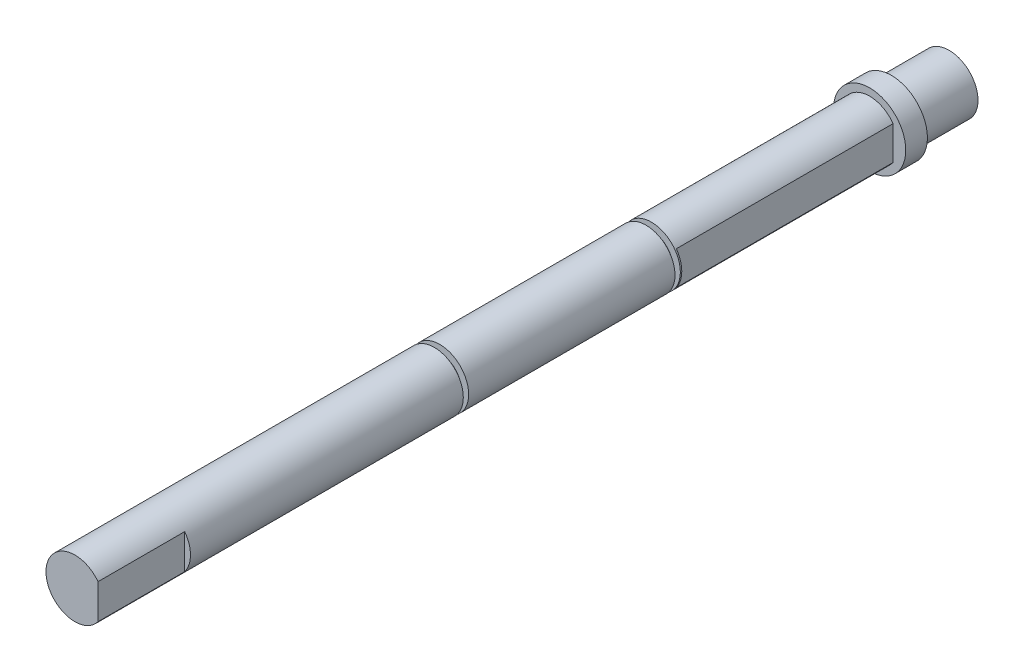
ISO-10303-21;
HEADER;
FILE_DESCRIPTION(('STEP AP214'),'2;1');
FILE_NAME('part.step','',(''),(''),'','','');
FILE_SCHEMA(('AUTOMOTIVE_DESIGN { 1 0 10303 214 1 1 1 1 }'));
ENDSEC;
DATA;
#1=APPLICATION_CONTEXT('core data for automotive mechanical design processes');
#2=APPLICATION_PROTOCOL_DEFINITION('international standard','automotive_design',2000,#1);
#3=PRODUCT_CONTEXT('',#1,'mechanical');
#4=PRODUCT('Part','Part','',(#3));
#5=PRODUCT_RELATED_PRODUCT_CATEGORY('part','',(#4));
#6=PRODUCT_DEFINITION_FORMATION('','',#4);
#7=PRODUCT_DEFINITION_CONTEXT('part definition',#1,'design');
#8=PRODUCT_DEFINITION('design','',#6,#7);
#9=PRODUCT_DEFINITION_SHAPE('','',#8);
#10=(LENGTH_UNIT() NAMED_UNIT(*) SI_UNIT(.MILLI.,.METRE.));
#11=(NAMED_UNIT(*) PLANE_ANGLE_UNIT() SI_UNIT($,.RADIAN.));
#12=(NAMED_UNIT(*) SI_UNIT($,.STERADIAN.) SOLID_ANGLE_UNIT());
#13=UNCERTAINTY_MEASURE_WITH_UNIT(LENGTH_MEASURE(1.E-05),#10,'distance_accuracy_value','');
#14=(GEOMETRIC_REPRESENTATION_CONTEXT(3) GLOBAL_UNCERTAINTY_ASSIGNED_CONTEXT((#13)) GLOBAL_UNIT_ASSIGNED_CONTEXT((#10,
#11,#12)) REPRESENTATION_CONTEXT('',''));
#15=CARTESIAN_POINT('',(0.,0.,0.));
#16=DIRECTION('',(0.,0.,1.));
#17=DIRECTION('',(1.,0.,0.));
#18=AXIS2_PLACEMENT_3D('',#15,#16,#17);
#19=CARTESIAN_POINT('',(0.,0.,121.));
#20=DIRECTION('',(0.,0.,1.));
#21=DIRECTION('',(1.,0.,0.));
#22=AXIS2_PLACEMENT_3D('',#19,#20,#21);
#23=PLANE('',#22);
#24=CARTESIAN_POINT('',(0.,0.,121.));
#25=DIRECTION('',(0.,0.,1.));
#26=DIRECTION('',(1.,0.,0.));
#27=AXIS2_PLACEMENT_3D('',#24,#25,#26);
#28=CIRCLE('',#27,4.);
#29=CARTESIAN_POINT('',(3.2,2.4,121.));
#30=VERTEX_POINT('',#29);
#31=CARTESIAN_POINT('',(3.2,-2.4,121.));
#32=VERTEX_POINT('',#31);
#33=EDGE_CURVE('E105',#30,#32,#28,.T.);
#34=ORIENTED_EDGE('',*,*,#33,.T.);
#35=DIRECTION('',(0.,-1.,0.));
#36=VECTOR('',#35,1.);
#37=CARTESIAN_POINT('',(3.2,-5.,121.));
#38=LINE('',#37,#36);
#39=EDGE_CURVE('E100',#30,#32,#38,.T.);
#40=ORIENTED_EDGE('',*,*,#39,.F.);
#41=EDGE_LOOP('',(#34,#40));
#42=FACE_BOUND('',#41,.T.);
#43=ADVANCED_FACE('F39',(#42),#23,.T.);
#44=CARTESIAN_POINT('',(0.,0.,121.));
#45=DIRECTION('',(0.,0.,-1.));
#46=DIRECTION('',(-1.,0.,0.));
#47=AXIS2_PLACEMENT_3D('',#44,#45,#46);
#48=CYLINDRICAL_SURFACE('',#47,4.);
#49=CARTESIAN_POINT('',(0.,0.,71.24));
#50=DIRECTION('',(0.,0.,1.));
#51=DIRECTION('',(1.,0.,0.));
#52=AXIS2_PLACEMENT_3D('',#49,#50,#51);
#53=CIRCLE('',#52,4.);
#54=CARTESIAN_POINT('',(4.,0.,71.24));
#55=VERTEX_POINT('',#54);
#56=EDGE_CURVE('E111',#55,#55,#53,.T.);
#57=ORIENTED_EDGE('',*,*,#56,.T.);
#58=EDGE_LOOP('',(#57));
#59=FACE_BOUND('',#58,.T.);
#60=DIRECTION('',(0.,0.,-1.));
#61=VECTOR('',#60,1.);
#62=CARTESIAN_POINT('',(3.2,-2.4,121.));
#63=LINE('',#62,#61);
#64=CARTESIAN_POINT('',(3.2,-2.4,109.));
#65=VERTEX_POINT('',#64);
#66=EDGE_CURVE('E11',#32,#65,#63,.T.);
#67=ORIENTED_EDGE('',*,*,#66,.F.);
#68=ORIENTED_EDGE('',*,*,#33,.F.);
#69=DIRECTION('',(0.,0.,-1.));
#70=VECTOR('',#69,1.);
#71=CARTESIAN_POINT('',(3.2,2.4,121.));
#72=LINE('',#71,#70);
#73=CARTESIAN_POINT('',(3.2,2.4,109.));
#74=VERTEX_POINT('',#73);
#75=EDGE_CURVE('E47',#74,#30,#72,.F.);
#76=ORIENTED_EDGE('',*,*,#75,.F.);
#77=CARTESIAN_POINT('',(0.,0.,109.));
#78=DIRECTION('',(0.,0.,-1.));
#79=DIRECTION('',(-1.,0.,0.));
#80=AXIS2_PLACEMENT_3D('',#77,#78,#79);
#81=CIRCLE('',#80,4.);
#82=EDGE_CURVE('E90',#74,#65,#81,.T.);
#83=ORIENTED_EDGE('',*,*,#82,.T.);
#84=EDGE_LOOP('',(#67,#68,#76,#83));
#85=FACE_BOUND('',#84,.T.);
#86=ADVANCED_FACE('F103',(#59,#85),#48,.T.);
#87=CARTESIAN_POINT('',(0.,0.,41.2));
#88=DIRECTION('',(0.,0.,1.));
#89=DIRECTION('',(1.,0.,0.));
#90=AXIS2_PLACEMENT_3D('',#87,#88,#89);
#91=CIRCLE('',#90,4.);
#92=CARTESIAN_POINT('',(4.,0.,41.2));
#93=VERTEX_POINT('',#92);
#94=EDGE_CURVE('E122',#93,#93,#91,.T.);
#95=ORIENTED_EDGE('',*,*,#94,.F.);
#96=EDGE_LOOP('',(#95));
#97=FACE_BOUND('',#96,.T.);
#98=DIRECTION('',(0.,0.,-1.));
#99=VECTOR('',#98,1.);
#100=CARTESIAN_POINT('',(3.25,-2.3318447632722,121.));
#101=LINE('',#100,#99);
#102=CARTESIAN_POINT('',(3.25,-2.3318447632722,41.));
#103=VERTEX_POINT('',#102);
#104=CARTESIAN_POINT('',(3.25,-2.3318447632722,11.));
#105=VERTEX_POINT('',#104);
#106=EDGE_CURVE('E149',#103,#105,#101,.T.);
#107=ORIENTED_EDGE('',*,*,#106,.F.);
#108=CARTESIAN_POINT('',(0.,0.,41.));
#109=DIRECTION('',(0.,0.,-1.));
#110=DIRECTION('',(-1.,0.,0.));
#111=AXIS2_PLACEMENT_3D('',#108,#109,#110);
#112=CIRCLE('',#111,4.);
#113=CARTESIAN_POINT('',(3.25,2.3318447632722,41.));
#114=VERTEX_POINT('',#113);
#115=EDGE_CURVE('E95',#114,#103,#112,.T.);
#116=ORIENTED_EDGE('',*,*,#115,.F.);
#117=DIRECTION('',(0.,0.,-1.));
#118=VECTOR('',#117,1.);
#119=CARTESIAN_POINT('',(3.25,2.3318447632722,121.));
#120=LINE('',#119,#118);
#121=CARTESIAN_POINT('',(3.25,2.3318447632722,11.));
#122=VERTEX_POINT('',#121);
#123=EDGE_CURVE('E153',#122,#114,#120,.F.);
#124=ORIENTED_EDGE('',*,*,#123,.F.);
#125=CARTESIAN_POINT('',(0.,0.,11.));
#126=DIRECTION('',(0.,0.,1.));
#127=DIRECTION('',(1.,0.,0.));
#128=AXIS2_PLACEMENT_3D('',#125,#126,#127);
#129=CIRCLE('',#128,4.);
#130=CARTESIAN_POINT('',(-3.25,2.3318447632722,11.));
#131=VERTEX_POINT('',#130);
#132=EDGE_CURVE('E110',#122,#131,#129,.T.);
#133=ORIENTED_EDGE('',*,*,#132,.T.);
#134=DIRECTION('',(0.,0.,-1.));
#135=VECTOR('',#134,1.);
#136=CARTESIAN_POINT('',(-3.25,2.3318447632722,121.));
#137=LINE('',#136,#135);
#138=CARTESIAN_POINT('',(-3.25,2.3318447632722,41.));
#139=VERTEX_POINT('',#138);
#140=EDGE_CURVE('E155',#139,#131,#137,.T.);
#141=ORIENTED_EDGE('',*,*,#140,.F.);
#142=CARTESIAN_POINT('',(0.,0.,41.));
#143=DIRECTION('',(0.,0.,-1.));
#144=DIRECTION('',(-1.,0.,0.));
#145=AXIS2_PLACEMENT_3D('',#142,#143,#144);
#146=CIRCLE('',#145,4.);
#147=CARTESIAN_POINT('',(-3.25,-2.3318447632722,41.));
#148=VERTEX_POINT('',#147);
#149=EDGE_CURVE('E108',#148,#139,#146,.T.);
#150=ORIENTED_EDGE('',*,*,#149,.F.);
#151=DIRECTION('',(0.,0.,-1.));
#152=VECTOR('',#151,1.);
#153=CARTESIAN_POINT('',(-3.25,-2.3318447632722,121.));
#154=LINE('',#153,#152);
#155=CARTESIAN_POINT('',(-3.25,-2.3318447632722,11.));
#156=VERTEX_POINT('',#155);
#157=EDGE_CURVE('E158',#156,#148,#154,.F.);
#158=ORIENTED_EDGE('',*,*,#157,.F.);
#159=EDGE_CURVE('E133',#156,#105,#129,.T.);
#160=ORIENTED_EDGE('',*,*,#159,.T.);
#161=EDGE_LOOP('',(#107,#116,#124,#133,#141,#150,#158,#160));
#162=FACE_BOUND('',#161,.T.);
#163=ADVANCED_FACE('F176',(#97,#162),#48,.T.);
#164=CARTESIAN_POINT('',(0.,0.,41.94));
#165=DIRECTION('',(0.,0.,1.));
#166=DIRECTION('',(1.,0.,0.));
#167=AXIS2_PLACEMENT_3D('',#164,#165,#166);
#168=CIRCLE('',#167,4.);
#169=CARTESIAN_POINT('',(4.,0.,41.94));
#170=VERTEX_POINT('',#169);
#171=EDGE_CURVE('E119',#170,#170,#168,.T.);
#172=ORIENTED_EDGE('',*,*,#171,.T.);
#173=EDGE_LOOP('',(#172));
#174=FACE_BOUND('',#173,.T.);
#175=CARTESIAN_POINT('',(0.,0.,70.5));
#176=DIRECTION('',(0.,0.,1.));
#177=DIRECTION('',(1.,0.,0.));
#178=AXIS2_PLACEMENT_3D('',#175,#176,#177);
#179=CIRCLE('',#178,4.);
#180=CARTESIAN_POINT('',(4.,0.,70.5));
#181=VERTEX_POINT('',#180);
#182=EDGE_CURVE('E115',#181,#181,#179,.T.);
#183=ORIENTED_EDGE('',*,*,#182,.F.);
#184=EDGE_LOOP('',(#183));
#185=FACE_BOUND('',#184,.T.);
#186=ADVANCED_FACE('F179',(#174,#185),#48,.T.);
#187=CARTESIAN_POINT('',(0.,0.,8.));
#188=DIRECTION('',(0.,0.,-1.));
#189=DIRECTION('',(-1.,0.,0.));
#190=AXIS2_PLACEMENT_3D('',#187,#188,#189);
#191=CYLINDRICAL_SURFACE('',#190,4.);
#192=CARTESIAN_POINT('',(0.,0.,8.));
#193=DIRECTION('',(0.,0.,1.));
#194=DIRECTION('',(1.,0.,0.));
#195=AXIS2_PLACEMENT_3D('',#192,#193,#194);
#196=CIRCLE('',#195,4.);
#197=CARTESIAN_POINT('',(4.,0.,8.));
#198=VERTEX_POINT('',#197);
#199=EDGE_CURVE('E129',#198,#198,#196,.T.);
#200=ORIENTED_EDGE('',*,*,#199,.F.);
#201=EDGE_LOOP('',(#200));
#202=FACE_BOUND('',#201,.T.);
#203=CARTESIAN_POINT('',(0.,0.,0.));
#204=DIRECTION('',(0.,0.,1.));
#205=DIRECTION('',(1.,0.,0.));
#206=AXIS2_PLACEMENT_3D('',#203,#204,#205);
#207=CIRCLE('',#206,4.);
#208=CARTESIAN_POINT('',(4.,0.,0.));
#209=VERTEX_POINT('',#208);
#210=EDGE_CURVE('E126',#209,#209,#207,.T.);
#211=ORIENTED_EDGE('',*,*,#210,.T.);
#212=EDGE_LOOP('',(#211));
#213=FACE_BOUND('',#212,.T.);
#214=ADVANCED_FACE('F41',(#202,#213),#191,.T.);
#215=CARTESIAN_POINT('',(0.,0.,0.));
#216=DIRECTION('',(0.,0.,1.));
#217=DIRECTION('',(1.,0.,0.));
#218=AXIS2_PLACEMENT_3D('',#215,#216,#217);
#219=PLANE('',#218);
#220=ORIENTED_EDGE('',*,*,#210,.F.);
#221=EDGE_LOOP('',(#220));
#222=FACE_BOUND('',#221,.T.);
#223=ADVANCED_FACE('F194',(#222),#219,.F.);
#224=CARTESIAN_POINT('',(0.,0.,11.));
#225=DIRECTION('',(0.,0.,-1.));
#226=DIRECTION('',(-1.,0.,0.));
#227=AXIS2_PLACEMENT_3D('',#224,#225,#226);
#228=CYLINDRICAL_SURFACE('',#227,5.);
#229=CARTESIAN_POINT('',(0.,0.,11.));
#230=DIRECTION('',(0.,0.,1.));
#231=DIRECTION('',(1.,0.,0.));
#232=AXIS2_PLACEMENT_3D('',#229,#230,#231);
#233=CIRCLE('',#232,5.);
#234=CARTESIAN_POINT('',(5.,0.,11.));
#235=VERTEX_POINT('',#234);
#236=EDGE_CURVE('E130',#235,#235,#233,.T.);
#237=ORIENTED_EDGE('',*,*,#236,.F.);
#238=EDGE_LOOP('',(#237));
#239=FACE_BOUND('',#238,.T.);
#240=CARTESIAN_POINT('',(0.,0.,8.));
#241=DIRECTION('',(0.,0.,1.));
#242=DIRECTION('',(1.,0.,0.));
#243=AXIS2_PLACEMENT_3D('',#240,#241,#242);
#244=CIRCLE('',#243,5.);
#245=CARTESIAN_POINT('',(5.,0.,8.));
#246=VERTEX_POINT('',#245);
#247=EDGE_CURVE('E134',#246,#246,#244,.T.);
#248=ORIENTED_EDGE('',*,*,#247,.T.);
#249=EDGE_LOOP('',(#248));
#250=FACE_BOUND('',#249,.T.);
#251=ADVANCED_FACE('F188',(#239,#250),#228,.T.);
#252=CARTESIAN_POINT('',(0.,0.,11.));
#253=DIRECTION('',(0.,0.,1.));
#254=DIRECTION('',(1.,0.,0.));
#255=AXIS2_PLACEMENT_3D('',#252,#253,#254);
#256=PLANE('',#255);
#257=ORIENTED_EDGE('',*,*,#132,.F.);
#258=DIRECTION('',(0.,-1.,0.));
#259=VECTOR('',#258,1.);
#260=CARTESIAN_POINT('',(3.25,-5.,11.));
#261=LINE('',#260,#259);
#262=EDGE_CURVE('E60',#122,#105,#261,.T.);
#263=ORIENTED_EDGE('',*,*,#262,.T.);
#264=ORIENTED_EDGE('',*,*,#159,.F.);
#265=DIRECTION('',(0.,1.,0.));
#266=VECTOR('',#265,1.);
#267=CARTESIAN_POINT('',(-3.25,-5.,11.));
#268=LINE('',#267,#266);
#269=EDGE_CURVE('E164',#156,#131,#268,.T.);
#270=ORIENTED_EDGE('',*,*,#269,.T.);
#271=EDGE_LOOP('',(#257,#263,#264,#270));
#272=FACE_BOUND('',#271,.T.);
#273=ORIENTED_EDGE('',*,*,#236,.T.);
#274=EDGE_LOOP('',(#273));
#275=FACE_BOUND('',#274,.T.);
#276=ADVANCED_FACE('F184',(#272,#275),#256,.T.);
#277=CARTESIAN_POINT('',(0.,0.,8.));
#278=DIRECTION('',(0.,0.,1.));
#279=DIRECTION('',(1.,0.,0.));
#280=AXIS2_PLACEMENT_3D('',#277,#278,#279);
#281=PLANE('',#280);
#282=ORIENTED_EDGE('',*,*,#199,.T.);
#283=EDGE_LOOP('',(#282));
#284=FACE_BOUND('',#283,.T.);
#285=ORIENTED_EDGE('',*,*,#247,.F.);
#286=EDGE_LOOP('',(#285));
#287=FACE_BOUND('',#286,.T.);
#288=ADVANCED_FACE('F187',(#284,#287),#281,.F.);
#289=CARTESIAN_POINT('',(0.,0.,41.94));
#290=DIRECTION('',(0.,0.,1.));
#291=DIRECTION('',(1.,0.,0.));
#292=AXIS2_PLACEMENT_3D('',#289,#290,#291);
#293=PLANE('',#292);
#294=CARTESIAN_POINT('',(0.,0.,41.94));
#295=DIRECTION('',(0.,0.,1.));
#296=DIRECTION('',(1.,0.,0.));
#297=AXIS2_PLACEMENT_3D('',#294,#295,#296);
#298=CIRCLE('',#297,3.);
#299=CARTESIAN_POINT('',(3.,0.,41.94));
#300=VERTEX_POINT('',#299);
#301=EDGE_CURVE('E125',#300,#300,#298,.T.);
#302=ORIENTED_EDGE('',*,*,#301,.T.);
#303=EDGE_LOOP('',(#302));
#304=FACE_BOUND('',#303,.T.);
#305=ORIENTED_EDGE('',*,*,#171,.F.);
#306=EDGE_LOOP('',(#305));
#307=FACE_BOUND('',#306,.T.);
#308=ADVANCED_FACE('F191',(#304,#307),#293,.F.);
#309=CARTESIAN_POINT('',(0.,0.,41.2));
#310=DIRECTION('',(0.,0.,1.));
#311=DIRECTION('',(1.,0.,0.));
#312=AXIS2_PLACEMENT_3D('',#309,#310,#311);
#313=PLANE('',#312);
#314=CARTESIAN_POINT('',(0.,0.,41.2));
#315=DIRECTION('',(0.,0.,1.));
#316=DIRECTION('',(1.,0.,0.));
#317=AXIS2_PLACEMENT_3D('',#314,#315,#316);
#318=CIRCLE('',#317,3.);
#319=CARTESIAN_POINT('',(3.,0.,41.2));
#320=VERTEX_POINT('',#319);
#321=EDGE_CURVE('E114',#320,#320,#318,.T.);
#322=ORIENTED_EDGE('',*,*,#321,.F.);
#323=EDGE_LOOP('',(#322));
#324=FACE_BOUND('',#323,.T.);
#325=ORIENTED_EDGE('',*,*,#94,.T.);
#326=EDGE_LOOP('',(#325));
#327=FACE_BOUND('',#326,.T.);
#328=ADVANCED_FACE('F181',(#324,#327),#313,.T.);
#329=CARTESIAN_POINT('',(0.,0.,41.94));
#330=DIRECTION('',(0.,0.,-1.));
#331=DIRECTION('',(-1.,0.,0.));
#332=AXIS2_PLACEMENT_3D('',#329,#330,#331);
#333=CYLINDRICAL_SURFACE('',#332,3.);
#334=ORIENTED_EDGE('',*,*,#301,.F.);
#335=EDGE_LOOP('',(#334));
#336=FACE_BOUND('',#335,.T.);
#337=ORIENTED_EDGE('',*,*,#321,.T.);
#338=EDGE_LOOP('',(#337));
#339=FACE_BOUND('',#338,.T.);
#340=ADVANCED_FACE('F234',(#336,#339),#333,.T.);
#341=CARTESIAN_POINT('',(0.,0.,71.24));
#342=DIRECTION('',(0.,0.,1.));
#343=DIRECTION('',(1.,0.,0.));
#344=AXIS2_PLACEMENT_3D('',#341,#342,#343);
#345=PLANE('',#344);
#346=CARTESIAN_POINT('',(0.,0.,71.24));
#347=DIRECTION('',(0.,0.,1.));
#348=DIRECTION('',(1.,0.,0.));
#349=AXIS2_PLACEMENT_3D('',#346,#347,#348);
#350=CIRCLE('',#349,3.);
#351=CARTESIAN_POINT('',(3.,0.,71.24));
#352=VERTEX_POINT('',#351);
#353=EDGE_CURVE('E118',#352,#352,#350,.T.);
#354=ORIENTED_EDGE('',*,*,#353,.T.);
#355=EDGE_LOOP('',(#354));
#356=FACE_BOUND('',#355,.T.);
#357=ORIENTED_EDGE('',*,*,#56,.F.);
#358=EDGE_LOOP('',(#357));
#359=FACE_BOUND('',#358,.T.);
#360=ADVANCED_FACE('F225',(#356,#359),#345,.F.);
#361=CARTESIAN_POINT('',(0.,0.,70.5));
#362=DIRECTION('',(0.,0.,1.));
#363=DIRECTION('',(1.,0.,0.));
#364=AXIS2_PLACEMENT_3D('',#361,#362,#363);
#365=PLANE('',#364);
#366=CARTESIAN_POINT('',(0.,0.,70.5));
#367=DIRECTION('',(0.,0.,1.));
#368=DIRECTION('',(1.,0.,0.));
#369=AXIS2_PLACEMENT_3D('',#366,#367,#368);
#370=CIRCLE('',#369,3.);
#371=CARTESIAN_POINT('',(3.,0.,70.5));
#372=VERTEX_POINT('',#371);
#373=EDGE_CURVE('E146',#372,#372,#370,.T.);
#374=ORIENTED_EDGE('',*,*,#373,.F.);
#375=EDGE_LOOP('',(#374));
#376=FACE_BOUND('',#375,.T.);
#377=ORIENTED_EDGE('',*,*,#182,.T.);
#378=EDGE_LOOP('',(#377));
#379=FACE_BOUND('',#378,.T.);
#380=ADVANCED_FACE('F222',(#376,#379),#365,.T.);
#381=CARTESIAN_POINT('',(0.,0.,71.24));
#382=DIRECTION('',(0.,0.,-1.));
#383=DIRECTION('',(-1.,0.,0.));
#384=AXIS2_PLACEMENT_3D('',#381,#382,#383);
#385=CYLINDRICAL_SURFACE('',#384,3.);
#386=ORIENTED_EDGE('',*,*,#353,.F.);
#387=EDGE_LOOP('',(#386));
#388=FACE_BOUND('',#387,.T.);
#389=ORIENTED_EDGE('',*,*,#373,.T.);
#390=EDGE_LOOP('',(#389));
#391=FACE_BOUND('',#390,.T.);
#392=ADVANCED_FACE('F224',(#388,#391),#385,.T.);
#393=CARTESIAN_POINT('',(0.,0.,41.));
#394=DIRECTION('',(0.,0.,-1.));
#395=DIRECTION('',(-1.,0.,0.));
#396=AXIS2_PLACEMENT_3D('',#393,#394,#395);
#397=PLANE('',#396);
#398=ORIENTED_EDGE('',*,*,#149,.T.);
#399=DIRECTION('',(0.,1.,0.));
#400=VECTOR('',#399,1.);
#401=CARTESIAN_POINT('',(-3.25,-5.,41.));
#402=LINE('',#401,#400);
#403=EDGE_CURVE('E161',#148,#139,#402,.T.);
#404=ORIENTED_EDGE('',*,*,#403,.F.);
#405=EDGE_LOOP('',(#398,#404));
#406=FACE_BOUND('',#405,.T.);
#407=ADVANCED_FACE('F231',(#406),#397,.T.);
#408=CARTESIAN_POINT('',(-3.25,-5.,41.));
#409=DIRECTION('',(-1.,0.,0.));
#410=DIRECTION('',(0.,0.,1.));
#411=AXIS2_PLACEMENT_3D('',#408,#409,#410);
#412=PLANE('',#411);
#413=ORIENTED_EDGE('',*,*,#140,.T.);
#414=ORIENTED_EDGE('',*,*,#269,.F.);
#415=ORIENTED_EDGE('',*,*,#157,.T.);
#416=ORIENTED_EDGE('',*,*,#403,.T.);
#417=EDGE_LOOP('',(#413,#414,#415,#416));
#418=FACE_BOUND('',#417,.T.);
#419=ADVANCED_FACE('F264',(#418),#412,.T.);
#420=CARTESIAN_POINT('',(0.,0.,41.));
#421=DIRECTION('',(0.,0.,-1.));
#422=DIRECTION('',(-1.,0.,0.));
#423=AXIS2_PLACEMENT_3D('',#420,#421,#422);
#424=PLANE('',#423);
#425=ORIENTED_EDGE('',*,*,#115,.T.);
#426=DIRECTION('',(0.,-1.,0.));
#427=VECTOR('',#426,1.);
#428=CARTESIAN_POINT('',(3.25,-5.,41.));
#429=LINE('',#428,#427);
#430=EDGE_CURVE('E160',#114,#103,#429,.T.);
#431=ORIENTED_EDGE('',*,*,#430,.F.);
#432=EDGE_LOOP('',(#425,#431));
#433=FACE_BOUND('',#432,.T.);
#434=ADVANCED_FACE('F262',(#433),#424,.T.);
#435=CARTESIAN_POINT('',(3.25,-5.,41.));
#436=DIRECTION('',(1.,0.,0.));
#437=DIRECTION('',(0.,0.,-1.));
#438=AXIS2_PLACEMENT_3D('',#435,#436,#437);
#439=PLANE('',#438);
#440=ORIENTED_EDGE('',*,*,#106,.T.);
#441=ORIENTED_EDGE('',*,*,#262,.F.);
#442=ORIENTED_EDGE('',*,*,#123,.T.);
#443=ORIENTED_EDGE('',*,*,#430,.T.);
#444=EDGE_LOOP('',(#440,#441,#442,#443));
#445=FACE_BOUND('',#444,.T.);
#446=ADVANCED_FACE('F259',(#445),#439,.T.);
#447=CARTESIAN_POINT('',(3.2,-5.,121.));
#448=DIRECTION('',(1.,0.,0.));
#449=DIRECTION('',(0.,0.,-1.));
#450=AXIS2_PLACEMENT_3D('',#447,#448,#449);
#451=PLANE('',#450);
#452=ORIENTED_EDGE('',*,*,#66,.T.);
#453=DIRECTION('',(0.,-1.,0.));
#454=VECTOR('',#453,1.);
#455=CARTESIAN_POINT('',(3.2,-5.,109.));
#456=LINE('',#455,#454);
#457=EDGE_CURVE('E53',#74,#65,#456,.T.);
#458=ORIENTED_EDGE('',*,*,#457,.F.);
#459=ORIENTED_EDGE('',*,*,#75,.T.);
#460=ORIENTED_EDGE('',*,*,#39,.T.);
#461=EDGE_LOOP('',(#452,#458,#459,#460));
#462=FACE_BOUND('',#461,.T.);
#463=ADVANCED_FACE('F98',(#462),#451,.T.);
#464=CARTESIAN_POINT('',(0.,0.,109.));
#465=DIRECTION('',(0.,0.,-1.));
#466=DIRECTION('',(-1.,0.,0.));
#467=AXIS2_PLACEMENT_3D('',#464,#465,#466);
#468=PLANE('',#467);
#469=ORIENTED_EDGE('',*,*,#457,.T.);
#470=ORIENTED_EDGE('',*,*,#82,.F.);
#471=EDGE_LOOP('',(#469,#470));
#472=FACE_BOUND('',#471,.T.);
#473=ADVANCED_FACE('F91',(#472),#468,.F.);
#474=CLOSED_SHELL('',(#43,#86,#163,#186,#214,#223,#251,#276,#288,#308,#328,#340,#360,#380,#392,
#407,#419,#434,#446,#463,#473));
#475=MANIFOLD_SOLID_BREP('B2',#474);
#476=ADVANCED_BREP_SHAPE_REPRESENTATION('',(#18,#475),#14);
#477=SHAPE_DEFINITION_REPRESENTATION(#9,#476);
ENDSEC;
END-ISO-10303-21;
